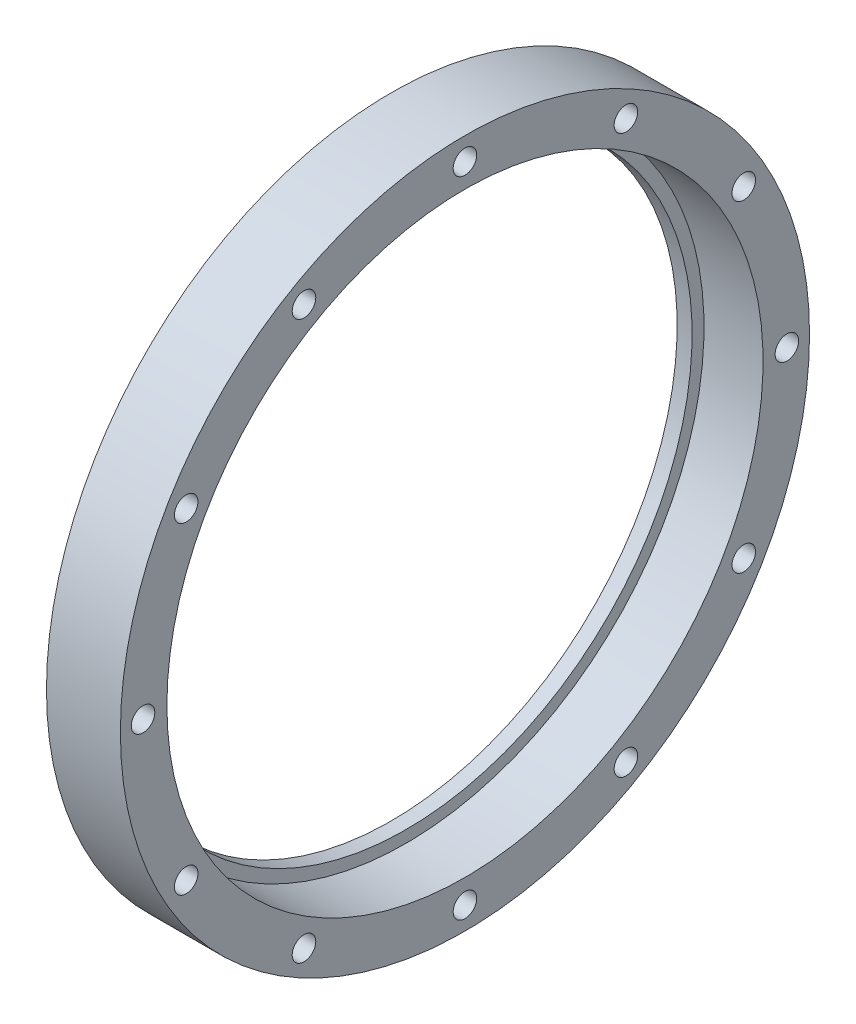
ISO-10303-21;
HEADER;
FILE_DESCRIPTION(('STEP AP214'),'2;1');
FILE_NAME('part.step','',(''),(''),'','','');
FILE_SCHEMA(('AUTOMOTIVE_DESIGN { 1 0 10303 214 1 1 1 1 }'));
ENDSEC;
DATA;
#1=APPLICATION_CONTEXT('core data for automotive mechanical design processes');
#2=APPLICATION_PROTOCOL_DEFINITION('international standard','automotive_design',2000,#1);
#3=PRODUCT_CONTEXT('',#1,'mechanical');
#4=PRODUCT('Part','Part','',(#3));
#5=PRODUCT_RELATED_PRODUCT_CATEGORY('part','',(#4));
#6=PRODUCT_DEFINITION_FORMATION('','',#4);
#7=PRODUCT_DEFINITION_CONTEXT('part definition',#1,'design');
#8=PRODUCT_DEFINITION('design','',#6,#7);
#9=PRODUCT_DEFINITION_SHAPE('','',#8);
#10=(LENGTH_UNIT() NAMED_UNIT(*) SI_UNIT(.MILLI.,.METRE.));
#11=(NAMED_UNIT(*) PLANE_ANGLE_UNIT() SI_UNIT($,.RADIAN.));
#12=(NAMED_UNIT(*) SI_UNIT($,.STERADIAN.) SOLID_ANGLE_UNIT());
#13=UNCERTAINTY_MEASURE_WITH_UNIT(LENGTH_MEASURE(1.E-05),#10,'distance_accuracy_value','');
#14=(GEOMETRIC_REPRESENTATION_CONTEXT(3) GLOBAL_UNCERTAINTY_ASSIGNED_CONTEXT((#13)) GLOBAL_UNIT_ASSIGNED_CONTEXT((#10,
#11,#12)) REPRESENTATION_CONTEXT('',''));
#15=CARTESIAN_POINT('',(0.,0.,0.));
#16=DIRECTION('',(0.,0.,1.));
#17=DIRECTION('',(1.,0.,0.));
#18=AXIS2_PLACEMENT_3D('',#15,#16,#17);
#19=CARTESIAN_POINT('',(0.,0.,0.));
#20=DIRECTION('',(-1.,0.,0.));
#21=DIRECTION('',(0.,0.,1.));
#22=AXIS2_PLACEMENT_3D('',#19,#20,#21);
#23=CYLINDRICAL_SURFACE('',#22,57.8);
#24=CARTESIAN_POINT('',(12.4,0.,0.));
#25=DIRECTION('',(-1.,0.,0.));
#26=DIRECTION('',(0.,0.,1.));
#27=AXIS2_PLACEMENT_3D('',#24,#25,#26);
#28=CIRCLE('',#27,57.8);
#29=CARTESIAN_POINT('',(12.4,0.,57.8));
#30=VERTEX_POINT('',#29);
#31=EDGE_CURVE('E202',#30,#30,#28,.T.);
#32=ORIENTED_EDGE('',*,*,#31,.T.);
#33=EDGE_LOOP('',(#32));
#34=FACE_BOUND('',#33,.T.);
#35=CARTESIAN_POINT('',(0.,0.,0.));
#36=DIRECTION('',(-1.,0.,0.));
#37=DIRECTION('',(0.,0.,1.));
#38=AXIS2_PLACEMENT_3D('',#35,#36,#37);
#39=CIRCLE('',#38,57.8);
#40=CARTESIAN_POINT('',(0.,0.,57.8));
#41=VERTEX_POINT('',#40);
#42=EDGE_CURVE('E10',#41,#41,#39,.T.);
#43=ORIENTED_EDGE('',*,*,#42,.F.);
#44=EDGE_LOOP('',(#43));
#45=FACE_BOUND('',#44,.T.);
#46=ADVANCED_FACE('F47',(#34,#45),#23,.T.);
#47=CARTESIAN_POINT('',(0.,0.,0.));
#48=DIRECTION('',(-1.,0.,0.));
#49=DIRECTION('',(0.,0.,1.));
#50=AXIS2_PLACEMENT_3D('',#47,#48,#49);
#51=PLANE('',#50);
#52=CARTESIAN_POINT('',(0.,46.76537180436,-26.9999999999994));
#53=DIRECTION('',(1.,0.,0.));
#54=DIRECTION('',(0.,0.,-1.));
#55=AXIS2_PLACEMENT_3D('',#52,#53,#54);
#56=CIRCLE('',#55,1.24999999999999);
#57=CARTESIAN_POINT('',(0.,46.76537180436,-28.2499999999994));
#58=VERTEX_POINT('',#57);
#59=EDGE_CURVE('E71',#58,#58,#56,.T.);
#60=ORIENTED_EDGE('',*,*,#59,.T.);
#61=EDGE_LOOP('',(#60));
#62=FACE_BOUND('',#61,.T.);
#63=CARTESIAN_POINT('',(0.,27.0000000000005,-46.7653718043594));
#64=DIRECTION('',(1.,0.,0.));
#65=DIRECTION('',(0.,0.,-1.));
#66=AXIS2_PLACEMENT_3D('',#63,#64,#65);
#67=CIRCLE('',#66,1.25);
#68=CARTESIAN_POINT('',(0.,27.0000000000005,-48.0153718043594));
#69=VERTEX_POINT('',#68);
#70=EDGE_CURVE('E165',#69,#69,#67,.T.);
#71=ORIENTED_EDGE('',*,*,#70,.T.);
#72=EDGE_LOOP('',(#71));
#73=FACE_BOUND('',#72,.T.);
#74=CARTESIAN_POINT('',(0.,5.65619976892588E-13,-54.));
#75=DIRECTION('',(1.,0.,0.));
#76=DIRECTION('',(0.,0.,-1.));
#77=AXIS2_PLACEMENT_3D('',#74,#75,#76);
#78=CIRCLE('',#77,1.25);
#79=CARTESIAN_POINT('',(0.,5.65619976892588E-13,-55.25));
#80=VERTEX_POINT('',#79);
#81=EDGE_CURVE('E168',#80,#80,#78,.T.);
#82=ORIENTED_EDGE('',*,*,#81,.T.);
#83=EDGE_LOOP('',(#82));
#84=FACE_BOUND('',#83,.T.);
#85=CARTESIAN_POINT('',(0.,-26.9999999999996,-46.7653718043599));
#86=DIRECTION('',(1.,0.,0.));
#87=DIRECTION('',(0.,0.,-1.));
#88=AXIS2_PLACEMENT_3D('',#85,#86,#87);
#89=CIRCLE('',#88,1.25);
#90=CARTESIAN_POINT('',(0.,-26.9999999999996,-48.0153718043599));
#91=VERTEX_POINT('',#90);
#92=EDGE_CURVE('E171',#91,#91,#89,.T.);
#93=ORIENTED_EDGE('',*,*,#92,.T.);
#94=EDGE_LOOP('',(#93));
#95=FACE_BOUND('',#94,.T.);
#96=CARTESIAN_POINT('',(0.,-46.7653718043595,-27.0000000000004));
#97=DIRECTION('',(1.,0.,0.));
#98=DIRECTION('',(0.,0.,-1.));
#99=AXIS2_PLACEMENT_3D('',#96,#97,#98);
#100=CIRCLE('',#99,1.24999999999999);
#101=CARTESIAN_POINT('',(0.,-46.7653718043595,-28.2500000000004));
#102=VERTEX_POINT('',#101);
#103=EDGE_CURVE('E174',#102,#102,#100,.T.);
#104=ORIENTED_EDGE('',*,*,#103,.T.);
#105=EDGE_LOOP('',(#104));
#106=FACE_BOUND('',#105,.T.);
#107=CARTESIAN_POINT('',(0.,-54.,0.));
#108=DIRECTION('',(1.,0.,0.));
#109=DIRECTION('',(0.,0.,-1.));
#110=AXIS2_PLACEMENT_3D('',#107,#108,#109);
#111=CIRCLE('',#110,1.24999999999999);
#112=CARTESIAN_POINT('',(0.,-54.,-1.24999999999999));
#113=VERTEX_POINT('',#112);
#114=EDGE_CURVE('E177',#113,#113,#111,.T.);
#115=ORIENTED_EDGE('',*,*,#114,.T.);
#116=EDGE_LOOP('',(#115));
#117=FACE_BOUND('',#116,.T.);
#118=CARTESIAN_POINT('',(0.,-46.7653718043598,26.9999999999997));
#119=DIRECTION('',(1.,0.,0.));
#120=DIRECTION('',(0.,0.,-1.));
#121=AXIS2_PLACEMENT_3D('',#118,#119,#120);
#122=CIRCLE('',#121,1.24999999999999);
#123=CARTESIAN_POINT('',(0.,-46.7653718043598,25.7499999999997));
#124=VERTEX_POINT('',#123);
#125=EDGE_CURVE('E180',#124,#124,#122,.T.);
#126=ORIENTED_EDGE('',*,*,#125,.T.);
#127=EDGE_LOOP('',(#126));
#128=FACE_BOUND('',#127,.T.);
#129=CARTESIAN_POINT('',(0.,-27.0000000000002,46.7653718043596));
#130=DIRECTION('',(1.,0.,0.));
#131=DIRECTION('',(0.,0.,-1.));
#132=AXIS2_PLACEMENT_3D('',#129,#130,#131);
#133=CIRCLE('',#132,1.25);
#134=CARTESIAN_POINT('',(0.,-27.0000000000002,45.5153718043596));
#135=VERTEX_POINT('',#134);
#136=EDGE_CURVE('E183',#135,#135,#133,.T.);
#137=ORIENTED_EDGE('',*,*,#136,.T.);
#138=EDGE_LOOP('',(#137));
#139=FACE_BOUND('',#138,.T.);
#140=CARTESIAN_POINT('',(0.,-1.88539992297529E-13,54.));
#141=DIRECTION('',(1.,0.,0.));
#142=DIRECTION('',(0.,0.,-1.));
#143=AXIS2_PLACEMENT_3D('',#140,#141,#142);
#144=CIRCLE('',#143,1.25);
#145=CARTESIAN_POINT('',(0.,-1.88539992297529E-13,52.75));
#146=VERTEX_POINT('',#145);
#147=EDGE_CURVE('E186',#146,#146,#144,.T.);
#148=ORIENTED_EDGE('',*,*,#147,.T.);
#149=EDGE_LOOP('',(#148));
#150=FACE_BOUND('',#149,.T.);
#151=CARTESIAN_POINT('',(0.,26.9999999999999,46.7653718043598));
#152=DIRECTION('',(1.,0.,0.));
#153=DIRECTION('',(0.,0.,-1.));
#154=AXIS2_PLACEMENT_3D('',#151,#152,#153);
#155=CIRCLE('',#154,1.25);
#156=CARTESIAN_POINT('',(0.,26.9999999999999,45.5153718043598));
#157=VERTEX_POINT('',#156);
#158=EDGE_CURVE('E189',#157,#157,#155,.T.);
#159=ORIENTED_EDGE('',*,*,#158,.T.);
#160=EDGE_LOOP('',(#159));
#161=FACE_BOUND('',#160,.T.);
#162=CARTESIAN_POINT('',(0.,46.7653718043597,27.0000000000001));
#163=DIRECTION('',(1.,0.,0.));
#164=DIRECTION('',(0.,0.,-1.));
#165=AXIS2_PLACEMENT_3D('',#162,#163,#164);
#166=CIRCLE('',#165,1.24999999999999);
#167=CARTESIAN_POINT('',(0.,46.7653718043597,25.7500000000001));
#168=VERTEX_POINT('',#167);
#169=EDGE_CURVE('E192',#168,#168,#166,.T.);
#170=ORIENTED_EDGE('',*,*,#169,.T.);
#171=EDGE_LOOP('',(#170));
#172=FACE_BOUND('',#171,.T.);
#173=CARTESIAN_POINT('',(0.,54.,0.));
#174=DIRECTION('',(1.,0.,0.));
#175=DIRECTION('',(0.,0.,-1.));
#176=AXIS2_PLACEMENT_3D('',#173,#174,#175);
#177=CIRCLE('',#176,1.24999999999999);
#178=CARTESIAN_POINT('',(0.,54.,-1.24999999999999));
#179=VERTEX_POINT('',#178);
#180=EDGE_CURVE('E66',#179,#179,#177,.T.);
#181=ORIENTED_EDGE('',*,*,#180,.T.);
#182=EDGE_LOOP('',(#181));
#183=FACE_BOUND('',#182,.T.);
#184=ORIENTED_EDGE('',*,*,#42,.T.);
#185=EDGE_LOOP('',(#184));
#186=FACE_BOUND('',#185,.T.);
#187=CARTESIAN_POINT('',(0.,0.,0.));
#188=DIRECTION('',(-1.,0.,0.));
#189=DIRECTION('',(0.,0.,1.));
#190=AXIS2_PLACEMENT_3D('',#187,#188,#189);
#191=CIRCLE('',#190,48.);
#192=CARTESIAN_POINT('',(0.,0.,48.));
#193=VERTEX_POINT('',#192);
#194=EDGE_CURVE('E54',#193,#193,#191,.T.);
#195=ORIENTED_EDGE('',*,*,#194,.F.);
#196=EDGE_LOOP('',(#195));
#197=FACE_BOUND('',#196,.T.);
#198=ADVANCED_FACE('F218',(#62,#73,#84,#95,#106,#117,#128,#139,#150,#161,#172,#183,#186,#197),
#51,.T.);
#199=CARTESIAN_POINT('',(0.,0.,0.));
#200=DIRECTION('',(-1.,0.,0.));
#201=DIRECTION('',(0.,0.,1.));
#202=AXIS2_PLACEMENT_3D('',#199,#200,#201);
#203=CYLINDRICAL_SURFACE('',#202,48.);
#204=CARTESIAN_POINT('',(2.5,0.,0.));
#205=DIRECTION('',(-1.,0.,0.));
#206=DIRECTION('',(0.,0.,1.));
#207=AXIS2_PLACEMENT_3D('',#204,#205,#206);
#208=CIRCLE('',#207,48.);
#209=CARTESIAN_POINT('',(2.5,0.,48.));
#210=VERTEX_POINT('',#209);
#211=EDGE_CURVE('E59',#210,#210,#208,.T.);
#212=ORIENTED_EDGE('',*,*,#211,.F.);
#213=EDGE_LOOP('',(#212));
#214=FACE_BOUND('',#213,.T.);
#215=ORIENTED_EDGE('',*,*,#194,.T.);
#216=EDGE_LOOP('',(#215));
#217=FACE_BOUND('',#216,.T.);
#218=ADVANCED_FACE('F215',(#214,#217),#203,.F.);
#219=CARTESIAN_POINT('',(2.5,0.,0.));
#220=DIRECTION('',(-1.,0.,0.));
#221=DIRECTION('',(0.,0.,1.));
#222=AXIS2_PLACEMENT_3D('',#219,#220,#221);
#223=PLANE('',#222);
#224=CARTESIAN_POINT('',(2.5,0.,0.));
#225=DIRECTION('',(-1.,0.,0.));
#226=DIRECTION('',(0.,0.,1.));
#227=AXIS2_PLACEMENT_3D('',#224,#225,#226);
#228=CIRCLE('',#227,50.);
#229=CARTESIAN_POINT('',(2.5,0.,50.));
#230=VERTEX_POINT('',#229);
#231=EDGE_CURVE('E208',#230,#230,#228,.T.);
#232=ORIENTED_EDGE('',*,*,#231,.F.);
#233=EDGE_LOOP('',(#232));
#234=FACE_BOUND('',#233,.T.);
#235=ORIENTED_EDGE('',*,*,#211,.T.);
#236=EDGE_LOOP('',(#235));
#237=FACE_BOUND('',#236,.T.);
#238=ADVANCED_FACE('F213',(#234,#237),#223,.F.);
#239=CARTESIAN_POINT('',(0.,0.,0.));
#240=DIRECTION('',(-1.,0.,0.));
#241=DIRECTION('',(0.,0.,1.));
#242=AXIS2_PLACEMENT_3D('',#239,#240,#241);
#243=CYLINDRICAL_SURFACE('',#242,50.);
#244=CARTESIAN_POINT('',(12.4,0.,0.));
#245=DIRECTION('',(-1.,0.,0.));
#246=DIRECTION('',(0.,0.,1.));
#247=AXIS2_PLACEMENT_3D('',#244,#245,#246);
#248=CIRCLE('',#247,50.);
#249=CARTESIAN_POINT('',(12.4,0.,50.));
#250=VERTEX_POINT('',#249);
#251=EDGE_CURVE('E205',#250,#250,#248,.T.);
#252=ORIENTED_EDGE('',*,*,#251,.F.);
#253=EDGE_LOOP('',(#252));
#254=FACE_BOUND('',#253,.T.);
#255=ORIENTED_EDGE('',*,*,#231,.T.);
#256=EDGE_LOOP('',(#255));
#257=FACE_BOUND('',#256,.T.);
#258=ADVANCED_FACE('F234',(#254,#257),#243,.F.);
#259=CARTESIAN_POINT('',(12.4,0.,0.));
#260=DIRECTION('',(1.,0.,0.));
#261=DIRECTION('',(0.,0.,-1.));
#262=AXIS2_PLACEMENT_3D('',#259,#260,#261);
#263=PLANE('',#262);
#264=CARTESIAN_POINT('',(12.4,46.76537180436,-26.9999999999994));
#265=DIRECTION('',(1.,0.,0.));
#266=DIRECTION('',(0.,0.,-1.));
#267=AXIS2_PLACEMENT_3D('',#264,#265,#266);
#268=CIRCLE('',#267,1.975);
#269=CARTESIAN_POINT('',(12.4,46.76537180436,-28.9749999999994));
#270=VERTEX_POINT('',#269);
#271=EDGE_CURVE('E390',#270,#270,#268,.T.);
#272=ORIENTED_EDGE('',*,*,#271,.F.);
#273=EDGE_LOOP('',(#272));
#274=FACE_BOUND('',#273,.T.);
#275=CARTESIAN_POINT('',(12.4,27.0000000000005,-46.7653718043594));
#276=DIRECTION('',(1.,0.,0.));
#277=DIRECTION('',(0.,0.,-1.));
#278=AXIS2_PLACEMENT_3D('',#275,#276,#277);
#279=CIRCLE('',#278,1.975);
#280=CARTESIAN_POINT('',(12.4,27.0000000000005,-48.7403718043594));
#281=VERTEX_POINT('',#280);
#282=EDGE_CURVE('E121',#281,#281,#279,.T.);
#283=ORIENTED_EDGE('',*,*,#282,.F.);
#284=EDGE_LOOP('',(#283));
#285=FACE_BOUND('',#284,.T.);
#286=CARTESIAN_POINT('',(12.4,5.65619976892588E-13,-54.));
#287=DIRECTION('',(1.,0.,0.));
#288=DIRECTION('',(0.,0.,-1.));
#289=AXIS2_PLACEMENT_3D('',#286,#287,#288);
#290=CIRCLE('',#289,1.975);
#291=CARTESIAN_POINT('',(12.4,5.65619976892588E-13,-55.975));
#292=VERTEX_POINT('',#291);
#293=EDGE_CURVE('E114',#292,#292,#290,.T.);
#294=ORIENTED_EDGE('',*,*,#293,.F.);
#295=EDGE_LOOP('',(#294));
#296=FACE_BOUND('',#295,.T.);
#297=CARTESIAN_POINT('',(12.4,-26.9999999999996,-46.7653718043599));
#298=DIRECTION('',(1.,0.,0.));
#299=DIRECTION('',(0.,0.,-1.));
#300=AXIS2_PLACEMENT_3D('',#297,#298,#299);
#301=CIRCLE('',#300,1.975);
#302=CARTESIAN_POINT('',(12.4,-26.9999999999996,-48.7403718043599));
#303=VERTEX_POINT('',#302);
#304=EDGE_CURVE('E110',#303,#303,#301,.T.);
#305=ORIENTED_EDGE('',*,*,#304,.F.);
#306=EDGE_LOOP('',(#305));
#307=FACE_BOUND('',#306,.T.);
#308=CARTESIAN_POINT('',(12.4,-46.7653718043595,-27.0000000000004));
#309=DIRECTION('',(1.,0.,0.));
#310=DIRECTION('',(0.,0.,-1.));
#311=AXIS2_PLACEMENT_3D('',#308,#309,#310);
#312=CIRCLE('',#311,1.975);
#313=CARTESIAN_POINT('',(12.4,-46.7653718043595,-28.9750000000004));
#314=VERTEX_POINT('',#313);
#315=EDGE_CURVE('E106',#314,#314,#312,.T.);
#316=ORIENTED_EDGE('',*,*,#315,.F.);
#317=EDGE_LOOP('',(#316));
#318=FACE_BOUND('',#317,.T.);
#319=CARTESIAN_POINT('',(12.4,-54.,0.));
#320=DIRECTION('',(1.,0.,0.));
#321=DIRECTION('',(0.,0.,-1.));
#322=AXIS2_PLACEMENT_3D('',#319,#320,#321);
#323=CIRCLE('',#322,1.975);
#324=CARTESIAN_POINT('',(12.4,-54.,-1.975));
#325=VERTEX_POINT('',#324);
#326=EDGE_CURVE('E101',#325,#325,#323,.T.);
#327=ORIENTED_EDGE('',*,*,#326,.F.);
#328=EDGE_LOOP('',(#327));
#329=FACE_BOUND('',#328,.T.);
#330=CARTESIAN_POINT('',(12.4,-46.7653718043598,26.9999999999997));
#331=DIRECTION('',(1.,0.,0.));
#332=DIRECTION('',(0.,0.,-1.));
#333=AXIS2_PLACEMENT_3D('',#330,#331,#332);
#334=CIRCLE('',#333,1.975);
#335=CARTESIAN_POINT('',(12.4,-46.7653718043598,25.0249999999997));
#336=VERTEX_POINT('',#335);
#337=EDGE_CURVE('E96',#336,#336,#334,.T.);
#338=ORIENTED_EDGE('',*,*,#337,.F.);
#339=EDGE_LOOP('',(#338));
#340=FACE_BOUND('',#339,.T.);
#341=CARTESIAN_POINT('',(12.4,-27.0000000000002,46.7653718043596));
#342=DIRECTION('',(1.,0.,0.));
#343=DIRECTION('',(0.,0.,-1.));
#344=AXIS2_PLACEMENT_3D('',#341,#342,#343);
#345=CIRCLE('',#344,1.975);
#346=CARTESIAN_POINT('',(12.4,-27.0000000000002,44.7903718043596));
#347=VERTEX_POINT('',#346);
#348=EDGE_CURVE('E91',#347,#347,#345,.T.);
#349=ORIENTED_EDGE('',*,*,#348,.F.);
#350=EDGE_LOOP('',(#349));
#351=FACE_BOUND('',#350,.T.);
#352=CARTESIAN_POINT('',(12.4,-1.88539992297529E-13,54.));
#353=DIRECTION('',(1.,0.,0.));
#354=DIRECTION('',(0.,0.,-1.));
#355=AXIS2_PLACEMENT_3D('',#352,#353,#354);
#356=CIRCLE('',#355,1.975);
#357=CARTESIAN_POINT('',(12.4,-1.88539992297529E-13,52.025));
#358=VERTEX_POINT('',#357);
#359=EDGE_CURVE('E86',#358,#358,#356,.T.);
#360=ORIENTED_EDGE('',*,*,#359,.F.);
#361=EDGE_LOOP('',(#360));
#362=FACE_BOUND('',#361,.T.);
#363=CARTESIAN_POINT('',(12.4,26.9999999999999,46.7653718043598));
#364=DIRECTION('',(1.,0.,0.));
#365=DIRECTION('',(0.,0.,-1.));
#366=AXIS2_PLACEMENT_3D('',#363,#364,#365);
#367=CIRCLE('',#366,1.975);
#368=CARTESIAN_POINT('',(12.4,26.9999999999999,44.7903718043598));
#369=VERTEX_POINT('',#368);
#370=EDGE_CURVE('E81',#369,#369,#367,.T.);
#371=ORIENTED_EDGE('',*,*,#370,.F.);
#372=EDGE_LOOP('',(#371));
#373=FACE_BOUND('',#372,.T.);
#374=CARTESIAN_POINT('',(12.4,46.7653718043597,27.0000000000001));
#375=DIRECTION('',(1.,0.,0.));
#376=DIRECTION('',(0.,0.,-1.));
#377=AXIS2_PLACEMENT_3D('',#374,#375,#376);
#378=CIRCLE('',#377,1.975);
#379=CARTESIAN_POINT('',(12.4,46.7653718043597,25.0250000000001));
#380=VERTEX_POINT('',#379);
#381=EDGE_CURVE('E76',#380,#380,#378,.T.);
#382=ORIENTED_EDGE('',*,*,#381,.F.);
#383=EDGE_LOOP('',(#382));
#384=FACE_BOUND('',#383,.T.);
#385=CARTESIAN_POINT('',(12.4,54.,0.));
#386=DIRECTION('',(1.,0.,0.));
#387=DIRECTION('',(0.,0.,-1.));
#388=AXIS2_PLACEMENT_3D('',#385,#386,#387);
#389=CIRCLE('',#388,1.975);
#390=CARTESIAN_POINT('',(12.4,54.,-1.975));
#391=VERTEX_POINT('',#390);
#392=EDGE_CURVE('E195',#391,#391,#389,.T.);
#393=ORIENTED_EDGE('',*,*,#392,.F.);
#394=EDGE_LOOP('',(#393));
#395=FACE_BOUND('',#394,.T.);
#396=ORIENTED_EDGE('',*,*,#251,.T.);
#397=EDGE_LOOP('',(#396));
#398=FACE_BOUND('',#397,.T.);
#399=ORIENTED_EDGE('',*,*,#31,.F.);
#400=EDGE_LOOP('',(#399));
#401=FACE_BOUND('',#400,.T.);
#402=ADVANCED_FACE('F238',(#274,#285,#296,#307,#318,#329,#340,#351,#362,#373,#384,#395,#398,
#401),#263,.T.);
#403=CARTESIAN_POINT('',(12.4,54.,0.));
#404=DIRECTION('',(1.,0.,0.));
#405=DIRECTION('',(0.,0.,-1.));
#406=AXIS2_PLACEMENT_3D('',#403,#404,#405);
#407=CYLINDRICAL_SURFACE('',#406,1.25);
#408=CARTESIAN_POINT('',(7.96437605120502,54.,0.));
#409=DIRECTION('',(1.,0.,0.));
#410=DIRECTION('',(0.,0.,-1.));
#411=AXIS2_PLACEMENT_3D('',#408,#409,#410);
#412=CIRCLE('',#411,1.25);
#413=CARTESIAN_POINT('',(7.96437605120502,54.,-1.25));
#414=VERTEX_POINT('',#413);
#415=EDGE_CURVE('E63',#414,#414,#412,.T.);
#416=ORIENTED_EDGE('',*,*,#415,.T.);
#417=EDGE_LOOP('',(#416));
#418=FACE_BOUND('',#417,.T.);
#419=ORIENTED_EDGE('',*,*,#180,.F.);
#420=EDGE_LOOP('',(#419));
#421=FACE_BOUND('',#420,.T.);
#422=ADVANCED_FACE('F241',(#418,#421),#407,.F.);
#423=CARTESIAN_POINT('',(8.4,54.,0.));
#424=DIRECTION('',(1.,0.,0.));
#425=DIRECTION('',(0.,0.,-1.));
#426=AXIS2_PLACEMENT_3D('',#423,#424,#425);
#427=CONICAL_SURFACE('',#426,1.975,1.02974425867665);
#428=CARTESIAN_POINT('',(8.4,54.,0.));
#429=DIRECTION('',(1.,0.,0.));
#430=DIRECTION('',(0.,0.,-1.));
#431=AXIS2_PLACEMENT_3D('',#428,#429,#430);
#432=CIRCLE('',#431,1.975);
#433=CARTESIAN_POINT('',(8.4,54.,-1.975));
#434=VERTEX_POINT('',#433);
#435=EDGE_CURVE('E67',#434,#434,#432,.T.);
#436=ORIENTED_EDGE('',*,*,#435,.T.);
#437=EDGE_LOOP('',(#436));
#438=FACE_BOUND('',#437,.T.);
#439=ORIENTED_EDGE('',*,*,#415,.F.);
#440=EDGE_LOOP('',(#439));
#441=FACE_BOUND('',#440,.T.);
#442=ADVANCED_FACE('F245',(#438,#441),#427,.F.);
#443=CARTESIAN_POINT('',(12.4,54.,0.));
#444=DIRECTION('',(1.,0.,0.));
#445=DIRECTION('',(0.,0.,-1.));
#446=AXIS2_PLACEMENT_3D('',#443,#444,#445);
#447=CYLINDRICAL_SURFACE('',#446,1.975);
#448=ORIENTED_EDGE('',*,*,#435,.F.);
#449=EDGE_LOOP('',(#448));
#450=FACE_BOUND('',#449,.T.);
#451=ORIENTED_EDGE('',*,*,#392,.T.);
#452=EDGE_LOOP('',(#451));
#453=FACE_BOUND('',#452,.T.);
#454=ADVANCED_FACE('F249',(#450,#453),#447,.F.);
#455=CARTESIAN_POINT('',(12.4,46.7653718043597,27.0000000000001));
#456=DIRECTION('',(1.,0.,0.));
#457=DIRECTION('',(0.,0.,-1.));
#458=AXIS2_PLACEMENT_3D('',#455,#456,#457);
#459=CYLINDRICAL_SURFACE('',#458,1.25);
#460=CARTESIAN_POINT('',(7.96437605120502,46.7653718043597,27.0000000000001));
#461=DIRECTION('',(1.,0.,0.));
#462=DIRECTION('',(0.,0.,-1.));
#463=AXIS2_PLACEMENT_3D('',#460,#461,#462);
#464=CIRCLE('',#463,1.25);
#465=CARTESIAN_POINT('',(7.96437605120502,46.7653718043597,25.7500000000001));
#466=VERTEX_POINT('',#465);
#467=EDGE_CURVE('E68',#466,#466,#464,.T.);
#468=ORIENTED_EDGE('',*,*,#467,.T.);
#469=EDGE_LOOP('',(#468));
#470=FACE_BOUND('',#469,.T.);
#471=ORIENTED_EDGE('',*,*,#169,.F.);
#472=EDGE_LOOP('',(#471));
#473=FACE_BOUND('',#472,.T.);
#474=ADVANCED_FACE('F252',(#470,#473),#459,.F.);
#475=CARTESIAN_POINT('',(12.4,26.9999999999999,46.7653718043598));
#476=DIRECTION('',(1.,0.,0.));
#477=DIRECTION('',(0.,0.,-1.));
#478=AXIS2_PLACEMENT_3D('',#475,#476,#477);
#479=CYLINDRICAL_SURFACE('',#478,1.25);
#480=CARTESIAN_POINT('',(7.96437605120502,26.9999999999999,46.7653718043598));
#481=DIRECTION('',(1.,0.,0.));
#482=DIRECTION('',(0.,0.,-1.));
#483=AXIS2_PLACEMENT_3D('',#480,#481,#482);
#484=CIRCLE('',#483,1.25);
#485=CARTESIAN_POINT('',(7.96437605120502,26.9999999999999,45.5153718043598));
#486=VERTEX_POINT('',#485);
#487=EDGE_CURVE('E73',#486,#486,#484,.T.);
#488=ORIENTED_EDGE('',*,*,#487,.T.);
#489=EDGE_LOOP('',(#488));
#490=FACE_BOUND('',#489,.T.);
#491=ORIENTED_EDGE('',*,*,#158,.F.);
#492=EDGE_LOOP('',(#491));
#493=FACE_BOUND('',#492,.T.);
#494=ADVANCED_FACE('F256',(#490,#493),#479,.F.);
#495=CARTESIAN_POINT('',(12.4,-1.88539992297529E-13,54.));
#496=DIRECTION('',(1.,0.,0.));
#497=DIRECTION('',(0.,0.,-1.));
#498=AXIS2_PLACEMENT_3D('',#495,#496,#497);
#499=CYLINDRICAL_SURFACE('',#498,1.25);
#500=CARTESIAN_POINT('',(7.96437605120502,-1.88539992297529E-13,54.));
#501=DIRECTION('',(1.,0.,0.));
#502=DIRECTION('',(0.,0.,-1.));
#503=AXIS2_PLACEMENT_3D('',#500,#501,#502);
#504=CIRCLE('',#503,1.25);
#505=CARTESIAN_POINT('',(7.96437605120502,-1.88539992297529E-13,52.75));
#506=VERTEX_POINT('',#505);
#507=EDGE_CURVE('E78',#506,#506,#504,.T.);
#508=ORIENTED_EDGE('',*,*,#507,.T.);
#509=EDGE_LOOP('',(#508));
#510=FACE_BOUND('',#509,.T.);
#511=ORIENTED_EDGE('',*,*,#147,.F.);
#512=EDGE_LOOP('',(#511));
#513=FACE_BOUND('',#512,.T.);
#514=ADVANCED_FACE('F260',(#510,#513),#499,.F.);
#515=CARTESIAN_POINT('',(12.4,-27.0000000000002,46.7653718043596));
#516=DIRECTION('',(1.,0.,0.));
#517=DIRECTION('',(0.,0.,-1.));
#518=AXIS2_PLACEMENT_3D('',#515,#516,#517);
#519=CYLINDRICAL_SURFACE('',#518,1.25);
#520=CARTESIAN_POINT('',(7.96437605120502,-27.0000000000002,46.7653718043596));
#521=DIRECTION('',(1.,0.,0.));
#522=DIRECTION('',(0.,0.,-1.));
#523=AXIS2_PLACEMENT_3D('',#520,#521,#522);
#524=CIRCLE('',#523,1.25);
#525=CARTESIAN_POINT('',(7.96437605120502,-27.0000000000002,45.5153718043596));
#526=VERTEX_POINT('',#525);
#527=EDGE_CURVE('E83',#526,#526,#524,.T.);
#528=ORIENTED_EDGE('',*,*,#527,.T.);
#529=EDGE_LOOP('',(#528));
#530=FACE_BOUND('',#529,.T.);
#531=ORIENTED_EDGE('',*,*,#136,.F.);
#532=EDGE_LOOP('',(#531));
#533=FACE_BOUND('',#532,.T.);
#534=ADVANCED_FACE('F264',(#530,#533),#519,.F.);
#535=CARTESIAN_POINT('',(12.4,-46.7653718043598,26.9999999999997));
#536=DIRECTION('',(1.,0.,0.));
#537=DIRECTION('',(0.,0.,-1.));
#538=AXIS2_PLACEMENT_3D('',#535,#536,#537);
#539=CYLINDRICAL_SURFACE('',#538,1.25);
#540=CARTESIAN_POINT('',(7.96437605120502,-46.7653718043598,26.9999999999997));
#541=DIRECTION('',(1.,0.,0.));
#542=DIRECTION('',(0.,0.,-1.));
#543=AXIS2_PLACEMENT_3D('',#540,#541,#542);
#544=CIRCLE('',#543,1.25);
#545=CARTESIAN_POINT('',(7.96437605120502,-46.7653718043598,25.7499999999997));
#546=VERTEX_POINT('',#545);
#547=EDGE_CURVE('E88',#546,#546,#544,.T.);
#548=ORIENTED_EDGE('',*,*,#547,.T.);
#549=EDGE_LOOP('',(#548));
#550=FACE_BOUND('',#549,.T.);
#551=ORIENTED_EDGE('',*,*,#125,.F.);
#552=EDGE_LOOP('',(#551));
#553=FACE_BOUND('',#552,.T.);
#554=ADVANCED_FACE('F268',(#550,#553),#539,.F.);
#555=CARTESIAN_POINT('',(12.4,-54.,0.));
#556=DIRECTION('',(1.,0.,0.));
#557=DIRECTION('',(0.,0.,-1.));
#558=AXIS2_PLACEMENT_3D('',#555,#556,#557);
#559=CYLINDRICAL_SURFACE('',#558,1.25);
#560=CARTESIAN_POINT('',(7.96437605120502,-54.,0.));
#561=DIRECTION('',(1.,0.,0.));
#562=DIRECTION('',(0.,0.,-1.));
#563=AXIS2_PLACEMENT_3D('',#560,#561,#562);
#564=CIRCLE('',#563,1.25);
#565=CARTESIAN_POINT('',(7.96437605120502,-54.,-1.25));
#566=VERTEX_POINT('',#565);
#567=EDGE_CURVE('E93',#566,#566,#564,.T.);
#568=ORIENTED_EDGE('',*,*,#567,.T.);
#569=EDGE_LOOP('',(#568));
#570=FACE_BOUND('',#569,.T.);
#571=ORIENTED_EDGE('',*,*,#114,.F.);
#572=EDGE_LOOP('',(#571));
#573=FACE_BOUND('',#572,.T.);
#574=ADVANCED_FACE('F272',(#570,#573),#559,.F.);
#575=CARTESIAN_POINT('',(12.4,-46.7653718043595,-27.0000000000004));
#576=DIRECTION('',(1.,0.,0.));
#577=DIRECTION('',(0.,0.,-1.));
#578=AXIS2_PLACEMENT_3D('',#575,#576,#577);
#579=CYLINDRICAL_SURFACE('',#578,1.25);
#580=CARTESIAN_POINT('',(7.96437605120502,-46.7653718043595,-27.0000000000004));
#581=DIRECTION('',(1.,0.,0.));
#582=DIRECTION('',(0.,0.,-1.));
#583=AXIS2_PLACEMENT_3D('',#580,#581,#582);
#584=CIRCLE('',#583,1.25);
#585=CARTESIAN_POINT('',(7.96437605120502,-46.7653718043595,-28.2500000000004));
#586=VERTEX_POINT('',#585);
#587=EDGE_CURVE('E98',#586,#586,#584,.T.);
#588=ORIENTED_EDGE('',*,*,#587,.T.);
#589=EDGE_LOOP('',(#588));
#590=FACE_BOUND('',#589,.T.);
#591=ORIENTED_EDGE('',*,*,#103,.F.);
#592=EDGE_LOOP('',(#591));
#593=FACE_BOUND('',#592,.T.);
#594=ADVANCED_FACE('F276',(#590,#593),#579,.F.);
#595=CARTESIAN_POINT('',(12.4,-26.9999999999996,-46.7653718043599));
#596=DIRECTION('',(1.,0.,0.));
#597=DIRECTION('',(0.,0.,-1.));
#598=AXIS2_PLACEMENT_3D('',#595,#596,#597);
#599=CYLINDRICAL_SURFACE('',#598,1.25);
#600=CARTESIAN_POINT('',(7.96437605120502,-26.9999999999996,-46.7653718043599));
#601=DIRECTION('',(1.,0.,0.));
#602=DIRECTION('',(0.,0.,-1.));
#603=AXIS2_PLACEMENT_3D('',#600,#601,#602);
#604=CIRCLE('',#603,1.25);
#605=CARTESIAN_POINT('',(7.96437605120502,-26.9999999999996,-48.0153718043599));
#606=VERTEX_POINT('',#605);
#607=EDGE_CURVE('E103',#606,#606,#604,.T.);
#608=ORIENTED_EDGE('',*,*,#607,.T.);
#609=EDGE_LOOP('',(#608));
#610=FACE_BOUND('',#609,.T.);
#611=ORIENTED_EDGE('',*,*,#92,.F.);
#612=EDGE_LOOP('',(#611));
#613=FACE_BOUND('',#612,.T.);
#614=ADVANCED_FACE('F280',(#610,#613),#599,.F.);
#615=CARTESIAN_POINT('',(12.4,5.65619976892588E-13,-54.));
#616=DIRECTION('',(1.,0.,0.));
#617=DIRECTION('',(0.,0.,-1.));
#618=AXIS2_PLACEMENT_3D('',#615,#616,#617);
#619=CYLINDRICAL_SURFACE('',#618,1.25);
#620=CARTESIAN_POINT('',(7.96437605120502,5.65619976892588E-13,-54.));
#621=DIRECTION('',(1.,0.,0.));
#622=DIRECTION('',(0.,0.,-1.));
#623=AXIS2_PLACEMENT_3D('',#620,#621,#622);
#624=CIRCLE('',#623,1.25);
#625=CARTESIAN_POINT('',(7.96437605120502,5.65619976892588E-13,-55.25));
#626=VERTEX_POINT('',#625);
#627=EDGE_CURVE('E108',#626,#626,#624,.T.);
#628=ORIENTED_EDGE('',*,*,#627,.T.);
#629=EDGE_LOOP('',(#628));
#630=FACE_BOUND('',#629,.T.);
#631=ORIENTED_EDGE('',*,*,#81,.F.);
#632=EDGE_LOOP('',(#631));
#633=FACE_BOUND('',#632,.T.);
#634=ADVANCED_FACE('F284',(#630,#633),#619,.F.);
#635=CARTESIAN_POINT('',(12.4,27.0000000000005,-46.7653718043594));
#636=DIRECTION('',(1.,0.,0.));
#637=DIRECTION('',(0.,0.,-1.));
#638=AXIS2_PLACEMENT_3D('',#635,#636,#637);
#639=CYLINDRICAL_SURFACE('',#638,1.25);
#640=CARTESIAN_POINT('',(7.96437605120502,27.0000000000005,-46.7653718043594));
#641=DIRECTION('',(1.,0.,0.));
#642=DIRECTION('',(0.,0.,-1.));
#643=AXIS2_PLACEMENT_3D('',#640,#641,#642);
#644=CIRCLE('',#643,1.25);
#645=CARTESIAN_POINT('',(7.96437605120502,27.0000000000005,-48.0153718043594));
#646=VERTEX_POINT('',#645);
#647=EDGE_CURVE('E112',#646,#646,#644,.T.);
#648=ORIENTED_EDGE('',*,*,#647,.T.);
#649=EDGE_LOOP('',(#648));
#650=FACE_BOUND('',#649,.T.);
#651=ORIENTED_EDGE('',*,*,#70,.F.);
#652=EDGE_LOOP('',(#651));
#653=FACE_BOUND('',#652,.T.);
#654=ADVANCED_FACE('F288',(#650,#653),#639,.F.);
#655=CARTESIAN_POINT('',(12.4,46.76537180436,-26.9999999999994));
#656=DIRECTION('',(1.,0.,0.));
#657=DIRECTION('',(0.,0.,-1.));
#658=AXIS2_PLACEMENT_3D('',#655,#656,#657);
#659=CYLINDRICAL_SURFACE('',#658,1.25);
#660=CARTESIAN_POINT('',(7.96437605120502,46.76537180436,-26.9999999999994));
#661=DIRECTION('',(1.,0.,0.));
#662=DIRECTION('',(0.,0.,-1.));
#663=AXIS2_PLACEMENT_3D('',#660,#661,#662);
#664=CIRCLE('',#663,1.25);
#665=CARTESIAN_POINT('',(7.96437605120502,46.76537180436,-28.2499999999994));
#666=VERTEX_POINT('',#665);
#667=EDGE_CURVE('E50',#666,#666,#664,.T.);
#668=ORIENTED_EDGE('',*,*,#667,.T.);
#669=EDGE_LOOP('',(#668));
#670=FACE_BOUND('',#669,.T.);
#671=ORIENTED_EDGE('',*,*,#59,.F.);
#672=EDGE_LOOP('',(#671));
#673=FACE_BOUND('',#672,.T.);
#674=ADVANCED_FACE('F292',(#670,#673),#659,.F.);
#675=CARTESIAN_POINT('',(8.4,46.7653718043597,27.0000000000001));
#676=DIRECTION('',(1.,0.,0.));
#677=DIRECTION('',(0.,0.,-1.));
#678=AXIS2_PLACEMENT_3D('',#675,#676,#677);
#679=CONICAL_SURFACE('',#678,1.975,1.02974425867665);
#680=CARTESIAN_POINT('',(8.4,46.7653718043597,27.0000000000001));
#681=DIRECTION('',(1.,0.,0.));
#682=DIRECTION('',(0.,0.,-1.));
#683=AXIS2_PLACEMENT_3D('',#680,#681,#682);
#684=CIRCLE('',#683,1.975);
#685=CARTESIAN_POINT('',(8.4,46.7653718043597,25.0250000000001));
#686=VERTEX_POINT('',#685);
#687=EDGE_CURVE('E72',#686,#686,#684,.T.);
#688=ORIENTED_EDGE('',*,*,#687,.T.);
#689=EDGE_LOOP('',(#688));
#690=FACE_BOUND('',#689,.T.);
#691=ORIENTED_EDGE('',*,*,#467,.F.);
#692=EDGE_LOOP('',(#691));
#693=FACE_BOUND('',#692,.T.);
#694=ADVANCED_FACE('F295',(#690,#693),#679,.F.);
#695=CARTESIAN_POINT('',(12.4,46.7653718043597,27.0000000000001));
#696=DIRECTION('',(1.,0.,0.));
#697=DIRECTION('',(0.,0.,-1.));
#698=AXIS2_PLACEMENT_3D('',#695,#696,#697);
#699=CYLINDRICAL_SURFACE('',#698,1.975);
#700=ORIENTED_EDGE('',*,*,#687,.F.);
#701=EDGE_LOOP('',(#700));
#702=FACE_BOUND('',#701,.T.);
#703=ORIENTED_EDGE('',*,*,#381,.T.);
#704=EDGE_LOOP('',(#703));
#705=FACE_BOUND('',#704,.T.);
#706=ADVANCED_FACE('F299',(#702,#705),#699,.F.);
#707=CARTESIAN_POINT('',(8.4,26.9999999999999,46.7653718043598));
#708=DIRECTION('',(1.,0.,0.));
#709=DIRECTION('',(0.,0.,-1.));
#710=AXIS2_PLACEMENT_3D('',#707,#708,#709);
#711=CONICAL_SURFACE('',#710,1.975,1.02974425867665);
#712=CARTESIAN_POINT('',(8.4,26.9999999999999,46.7653718043598));
#713=DIRECTION('',(1.,0.,0.));
#714=DIRECTION('',(0.,0.,-1.));
#715=AXIS2_PLACEMENT_3D('',#712,#713,#714);
#716=CIRCLE('',#715,1.975);
#717=CARTESIAN_POINT('',(8.4,26.9999999999999,44.7903718043598));
#718=VERTEX_POINT('',#717);
#719=EDGE_CURVE('E77',#718,#718,#716,.T.);
#720=ORIENTED_EDGE('',*,*,#719,.T.);
#721=EDGE_LOOP('',(#720));
#722=FACE_BOUND('',#721,.T.);
#723=ORIENTED_EDGE('',*,*,#487,.F.);
#724=EDGE_LOOP('',(#723));
#725=FACE_BOUND('',#724,.T.);
#726=ADVANCED_FACE('F303',(#722,#725),#711,.F.);
#727=CARTESIAN_POINT('',(12.4,26.9999999999999,46.7653718043598));
#728=DIRECTION('',(1.,0.,0.));
#729=DIRECTION('',(0.,0.,-1.));
#730=AXIS2_PLACEMENT_3D('',#727,#728,#729);
#731=CYLINDRICAL_SURFACE('',#730,1.975);
#732=ORIENTED_EDGE('',*,*,#719,.F.);
#733=EDGE_LOOP('',(#732));
#734=FACE_BOUND('',#733,.T.);
#735=ORIENTED_EDGE('',*,*,#370,.T.);
#736=EDGE_LOOP('',(#735));
#737=FACE_BOUND('',#736,.T.);
#738=ADVANCED_FACE('F307',(#734,#737),#731,.F.);
#739=CARTESIAN_POINT('',(8.4,-1.88539992297529E-13,54.));
#740=DIRECTION('',(1.,0.,0.));
#741=DIRECTION('',(0.,0.,-1.));
#742=AXIS2_PLACEMENT_3D('',#739,#740,#741);
#743=CONICAL_SURFACE('',#742,1.975,1.02974425867665);
#744=CARTESIAN_POINT('',(8.4,-1.88539992297529E-13,54.));
#745=DIRECTION('',(1.,0.,0.));
#746=DIRECTION('',(0.,0.,-1.));
#747=AXIS2_PLACEMENT_3D('',#744,#745,#746);
#748=CIRCLE('',#747,1.975);
#749=CARTESIAN_POINT('',(8.4,-1.88539992297529E-13,52.025));
#750=VERTEX_POINT('',#749);
#751=EDGE_CURVE('E82',#750,#750,#748,.T.);
#752=ORIENTED_EDGE('',*,*,#751,.T.);
#753=EDGE_LOOP('',(#752));
#754=FACE_BOUND('',#753,.T.);
#755=ORIENTED_EDGE('',*,*,#507,.F.);
#756=EDGE_LOOP('',(#755));
#757=FACE_BOUND('',#756,.T.);
#758=ADVANCED_FACE('F311',(#754,#757),#743,.F.);
#759=CARTESIAN_POINT('',(12.4,-1.88539992297529E-13,54.));
#760=DIRECTION('',(1.,0.,0.));
#761=DIRECTION('',(0.,0.,-1.));
#762=AXIS2_PLACEMENT_3D('',#759,#760,#761);
#763=CYLINDRICAL_SURFACE('',#762,1.975);
#764=ORIENTED_EDGE('',*,*,#751,.F.);
#765=EDGE_LOOP('',(#764));
#766=FACE_BOUND('',#765,.T.);
#767=ORIENTED_EDGE('',*,*,#359,.T.);
#768=EDGE_LOOP('',(#767));
#769=FACE_BOUND('',#768,.T.);
#770=ADVANCED_FACE('F315',(#766,#769),#763,.F.);
#771=CARTESIAN_POINT('',(8.4,-27.0000000000002,46.7653718043596));
#772=DIRECTION('',(1.,0.,0.));
#773=DIRECTION('',(0.,0.,-1.));
#774=AXIS2_PLACEMENT_3D('',#771,#772,#773);
#775=CONICAL_SURFACE('',#774,1.975,1.02974425867665);
#776=CARTESIAN_POINT('',(8.4,-27.0000000000002,46.7653718043596));
#777=DIRECTION('',(1.,0.,0.));
#778=DIRECTION('',(0.,0.,-1.));
#779=AXIS2_PLACEMENT_3D('',#776,#777,#778);
#780=CIRCLE('',#779,1.975);
#781=CARTESIAN_POINT('',(8.4,-27.0000000000002,44.7903718043596));
#782=VERTEX_POINT('',#781);
#783=EDGE_CURVE('E87',#782,#782,#780,.T.);
#784=ORIENTED_EDGE('',*,*,#783,.T.);
#785=EDGE_LOOP('',(#784));
#786=FACE_BOUND('',#785,.T.);
#787=ORIENTED_EDGE('',*,*,#527,.F.);
#788=EDGE_LOOP('',(#787));
#789=FACE_BOUND('',#788,.T.);
#790=ADVANCED_FACE('F319',(#786,#789),#775,.F.);
#791=CARTESIAN_POINT('',(12.4,-27.0000000000002,46.7653718043596));
#792=DIRECTION('',(1.,0.,0.));
#793=DIRECTION('',(0.,0.,-1.));
#794=AXIS2_PLACEMENT_3D('',#791,#792,#793);
#795=CYLINDRICAL_SURFACE('',#794,1.975);
#796=ORIENTED_EDGE('',*,*,#783,.F.);
#797=EDGE_LOOP('',(#796));
#798=FACE_BOUND('',#797,.T.);
#799=ORIENTED_EDGE('',*,*,#348,.T.);
#800=EDGE_LOOP('',(#799));
#801=FACE_BOUND('',#800,.T.);
#802=ADVANCED_FACE('F323',(#798,#801),#795,.F.);
#803=CARTESIAN_POINT('',(8.4,-46.7653718043598,26.9999999999997));
#804=DIRECTION('',(1.,0.,0.));
#805=DIRECTION('',(0.,0.,-1.));
#806=AXIS2_PLACEMENT_3D('',#803,#804,#805);
#807=CONICAL_SURFACE('',#806,1.975,1.02974425867665);
#808=CARTESIAN_POINT('',(8.4,-46.7653718043598,26.9999999999997));
#809=DIRECTION('',(1.,0.,0.));
#810=DIRECTION('',(0.,0.,-1.));
#811=AXIS2_PLACEMENT_3D('',#808,#809,#810);
#812=CIRCLE('',#811,1.975);
#813=CARTESIAN_POINT('',(8.4,-46.7653718043598,25.0249999999997));
#814=VERTEX_POINT('',#813);
#815=EDGE_CURVE('E92',#814,#814,#812,.T.);
#816=ORIENTED_EDGE('',*,*,#815,.T.);
#817=EDGE_LOOP('',(#816));
#818=FACE_BOUND('',#817,.T.);
#819=ORIENTED_EDGE('',*,*,#547,.F.);
#820=EDGE_LOOP('',(#819));
#821=FACE_BOUND('',#820,.T.);
#822=ADVANCED_FACE('F327',(#818,#821),#807,.F.);
#823=CARTESIAN_POINT('',(12.4,-46.7653718043598,26.9999999999997));
#824=DIRECTION('',(1.,0.,0.));
#825=DIRECTION('',(0.,0.,-1.));
#826=AXIS2_PLACEMENT_3D('',#823,#824,#825);
#827=CYLINDRICAL_SURFACE('',#826,1.975);
#828=ORIENTED_EDGE('',*,*,#815,.F.);
#829=EDGE_LOOP('',(#828));
#830=FACE_BOUND('',#829,.T.);
#831=ORIENTED_EDGE('',*,*,#337,.T.);
#832=EDGE_LOOP('',(#831));
#833=FACE_BOUND('',#832,.T.);
#834=ADVANCED_FACE('F331',(#830,#833),#827,.F.);
#835=CARTESIAN_POINT('',(8.4,-54.,0.));
#836=DIRECTION('',(1.,0.,0.));
#837=DIRECTION('',(0.,0.,-1.));
#838=AXIS2_PLACEMENT_3D('',#835,#836,#837);
#839=CONICAL_SURFACE('',#838,1.975,1.02974425867665);
#840=CARTESIAN_POINT('',(8.4,-54.,0.));
#841=DIRECTION('',(1.,0.,0.));
#842=DIRECTION('',(0.,0.,-1.));
#843=AXIS2_PLACEMENT_3D('',#840,#841,#842);
#844=CIRCLE('',#843,1.975);
#845=CARTESIAN_POINT('',(8.4,-54.,-1.975));
#846=VERTEX_POINT('',#845);
#847=EDGE_CURVE('E97',#846,#846,#844,.T.);
#848=ORIENTED_EDGE('',*,*,#847,.T.);
#849=EDGE_LOOP('',(#848));
#850=FACE_BOUND('',#849,.T.);
#851=ORIENTED_EDGE('',*,*,#567,.F.);
#852=EDGE_LOOP('',(#851));
#853=FACE_BOUND('',#852,.T.);
#854=ADVANCED_FACE('F335',(#850,#853),#839,.F.);
#855=CARTESIAN_POINT('',(12.4,-54.,0.));
#856=DIRECTION('',(1.,0.,0.));
#857=DIRECTION('',(0.,0.,-1.));
#858=AXIS2_PLACEMENT_3D('',#855,#856,#857);
#859=CYLINDRICAL_SURFACE('',#858,1.975);
#860=ORIENTED_EDGE('',*,*,#847,.F.);
#861=EDGE_LOOP('',(#860));
#862=FACE_BOUND('',#861,.T.);
#863=ORIENTED_EDGE('',*,*,#326,.T.);
#864=EDGE_LOOP('',(#863));
#865=FACE_BOUND('',#864,.T.);
#866=ADVANCED_FACE('F339',(#862,#865),#859,.F.);
#867=CARTESIAN_POINT('',(8.4,-46.7653718043595,-27.0000000000004));
#868=DIRECTION('',(1.,0.,0.));
#869=DIRECTION('',(0.,0.,-1.));
#870=AXIS2_PLACEMENT_3D('',#867,#868,#869);
#871=CONICAL_SURFACE('',#870,1.975,1.02974425867665);
#872=CARTESIAN_POINT('',(8.4,-46.7653718043595,-27.0000000000004));
#873=DIRECTION('',(1.,0.,0.));
#874=DIRECTION('',(0.,0.,-1.));
#875=AXIS2_PLACEMENT_3D('',#872,#873,#874);
#876=CIRCLE('',#875,1.975);
#877=CARTESIAN_POINT('',(8.4,-46.7653718043595,-28.9750000000004));
#878=VERTEX_POINT('',#877);
#879=EDGE_CURVE('E102',#878,#878,#876,.T.);
#880=ORIENTED_EDGE('',*,*,#879,.T.);
#881=EDGE_LOOP('',(#880));
#882=FACE_BOUND('',#881,.T.);
#883=ORIENTED_EDGE('',*,*,#587,.F.);
#884=EDGE_LOOP('',(#883));
#885=FACE_BOUND('',#884,.T.);
#886=ADVANCED_FACE('F343',(#882,#885),#871,.F.);
#887=CARTESIAN_POINT('',(12.4,-46.7653718043595,-27.0000000000004));
#888=DIRECTION('',(1.,0.,0.));
#889=DIRECTION('',(0.,0.,-1.));
#890=AXIS2_PLACEMENT_3D('',#887,#888,#889);
#891=CYLINDRICAL_SURFACE('',#890,1.975);
#892=ORIENTED_EDGE('',*,*,#879,.F.);
#893=EDGE_LOOP('',(#892));
#894=FACE_BOUND('',#893,.T.);
#895=ORIENTED_EDGE('',*,*,#315,.T.);
#896=EDGE_LOOP('',(#895));
#897=FACE_BOUND('',#896,.T.);
#898=ADVANCED_FACE('F347',(#894,#897),#891,.F.);
#899=CARTESIAN_POINT('',(8.4,-26.9999999999996,-46.7653718043599));
#900=DIRECTION('',(1.,0.,0.));
#901=DIRECTION('',(0.,0.,-1.));
#902=AXIS2_PLACEMENT_3D('',#899,#900,#901);
#903=CONICAL_SURFACE('',#902,1.975,1.02974425867665);
#904=CARTESIAN_POINT('',(8.4,-26.9999999999996,-46.7653718043599));
#905=DIRECTION('',(1.,0.,0.));
#906=DIRECTION('',(0.,0.,-1.));
#907=AXIS2_PLACEMENT_3D('',#904,#905,#906);
#908=CIRCLE('',#907,1.975);
#909=CARTESIAN_POINT('',(8.4,-26.9999999999996,-48.7403718043599));
#910=VERTEX_POINT('',#909);
#911=EDGE_CURVE('E107',#910,#910,#908,.T.);
#912=ORIENTED_EDGE('',*,*,#911,.T.);
#913=EDGE_LOOP('',(#912));
#914=FACE_BOUND('',#913,.T.);
#915=ORIENTED_EDGE('',*,*,#607,.F.);
#916=EDGE_LOOP('',(#915));
#917=FACE_BOUND('',#916,.T.);
#918=ADVANCED_FACE('F351',(#914,#917),#903,.F.);
#919=CARTESIAN_POINT('',(12.4,-26.9999999999996,-46.7653718043599));
#920=DIRECTION('',(1.,0.,0.));
#921=DIRECTION('',(0.,0.,-1.));
#922=AXIS2_PLACEMENT_3D('',#919,#920,#921);
#923=CYLINDRICAL_SURFACE('',#922,1.975);
#924=ORIENTED_EDGE('',*,*,#911,.F.);
#925=EDGE_LOOP('',(#924));
#926=FACE_BOUND('',#925,.T.);
#927=ORIENTED_EDGE('',*,*,#304,.T.);
#928=EDGE_LOOP('',(#927));
#929=FACE_BOUND('',#928,.T.);
#930=ADVANCED_FACE('F355',(#926,#929),#923,.F.);
#931=CARTESIAN_POINT('',(8.4,5.65619976892588E-13,-54.));
#932=DIRECTION('',(1.,0.,0.));
#933=DIRECTION('',(0.,0.,-1.));
#934=AXIS2_PLACEMENT_3D('',#931,#932,#933);
#935=CONICAL_SURFACE('',#934,1.975,1.02974425867665);
#936=CARTESIAN_POINT('',(8.4,5.65619976892588E-13,-54.));
#937=DIRECTION('',(1.,0.,0.));
#938=DIRECTION('',(0.,0.,-1.));
#939=AXIS2_PLACEMENT_3D('',#936,#937,#938);
#940=CIRCLE('',#939,1.975);
#941=CARTESIAN_POINT('',(8.4,5.65619976892588E-13,-55.975));
#942=VERTEX_POINT('',#941);
#943=EDGE_CURVE('E111',#942,#942,#940,.T.);
#944=ORIENTED_EDGE('',*,*,#943,.T.);
#945=EDGE_LOOP('',(#944));
#946=FACE_BOUND('',#945,.T.);
#947=ORIENTED_EDGE('',*,*,#627,.F.);
#948=EDGE_LOOP('',(#947));
#949=FACE_BOUND('',#948,.T.);
#950=ADVANCED_FACE('F359',(#946,#949),#935,.F.);
#951=CARTESIAN_POINT('',(12.4,5.65619976892588E-13,-54.));
#952=DIRECTION('',(1.,0.,0.));
#953=DIRECTION('',(0.,0.,-1.));
#954=AXIS2_PLACEMENT_3D('',#951,#952,#953);
#955=CYLINDRICAL_SURFACE('',#954,1.975);
#956=ORIENTED_EDGE('',*,*,#943,.F.);
#957=EDGE_LOOP('',(#956));
#958=FACE_BOUND('',#957,.T.);
#959=ORIENTED_EDGE('',*,*,#293,.T.);
#960=EDGE_LOOP('',(#959));
#961=FACE_BOUND('',#960,.T.);
#962=ADVANCED_FACE('F363',(#958,#961),#955,.F.);
#963=CARTESIAN_POINT('',(8.4,27.0000000000005,-46.7653718043594));
#964=DIRECTION('',(1.,0.,0.));
#965=DIRECTION('',(0.,0.,-1.));
#966=AXIS2_PLACEMENT_3D('',#963,#964,#965);
#967=CONICAL_SURFACE('',#966,1.975,1.02974425867665);
#968=CARTESIAN_POINT('',(8.4,27.0000000000005,-46.7653718043594));
#969=DIRECTION('',(1.,0.,0.));
#970=DIRECTION('',(0.,0.,-1.));
#971=AXIS2_PLACEMENT_3D('',#968,#969,#970);
#972=CIRCLE('',#971,1.975);
#973=CARTESIAN_POINT('',(8.4,27.0000000000005,-48.7403718043594));
#974=VERTEX_POINT('',#973);
#975=EDGE_CURVE('E115',#974,#974,#972,.T.);
#976=ORIENTED_EDGE('',*,*,#975,.T.);
#977=EDGE_LOOP('',(#976));
#978=FACE_BOUND('',#977,.T.);
#979=ORIENTED_EDGE('',*,*,#647,.F.);
#980=EDGE_LOOP('',(#979));
#981=FACE_BOUND('',#980,.T.);
#982=ADVANCED_FACE('F367',(#978,#981),#967,.F.);
#983=CARTESIAN_POINT('',(12.4,27.0000000000005,-46.7653718043594));
#984=DIRECTION('',(1.,0.,0.));
#985=DIRECTION('',(0.,0.,-1.));
#986=AXIS2_PLACEMENT_3D('',#983,#984,#985);
#987=CYLINDRICAL_SURFACE('',#986,1.975);
#988=ORIENTED_EDGE('',*,*,#975,.F.);
#989=EDGE_LOOP('',(#988));
#990=FACE_BOUND('',#989,.T.);
#991=ORIENTED_EDGE('',*,*,#282,.T.);
#992=EDGE_LOOP('',(#991));
#993=FACE_BOUND('',#992,.T.);
#994=ADVANCED_FACE('F371',(#990,#993),#987,.F.);
#995=CARTESIAN_POINT('',(8.4,46.76537180436,-26.9999999999994));
#996=DIRECTION('',(1.,0.,0.));
#997=DIRECTION('',(0.,0.,-1.));
#998=AXIS2_PLACEMENT_3D('',#995,#996,#997);
#999=CONICAL_SURFACE('',#998,1.975,1.02974425867665);
#1000=CARTESIAN_POINT('',(8.4,46.76537180436,-26.9999999999994));
#1001=DIRECTION('',(1.,0.,0.));
#1002=DIRECTION('',(0.,0.,-1.));
#1003=AXIS2_PLACEMENT_3D('',#1000,#1001,#1002);
#1004=CIRCLE('',#1003,1.975);
#1005=CARTESIAN_POINT('',(8.4,46.76537180436,-28.9749999999994));
#1006=VERTEX_POINT('',#1005);
#1007=EDGE_CURVE('E387',#1006,#1006,#1004,.T.);
#1008=ORIENTED_EDGE('',*,*,#1007,.T.);
#1009=EDGE_LOOP('',(#1008));
#1010=FACE_BOUND('',#1009,.T.);
#1011=ORIENTED_EDGE('',*,*,#667,.F.);
#1012=EDGE_LOOP('',(#1011));
#1013=FACE_BOUND('',#1012,.T.);
#1014=ADVANCED_FACE('F374',(#1010,#1013),#999,.F.);
#1015=CARTESIAN_POINT('',(12.4,46.76537180436,-26.9999999999994));
#1016=DIRECTION('',(1.,0.,0.));
#1017=DIRECTION('',(0.,0.,-1.));
#1018=AXIS2_PLACEMENT_3D('',#1015,#1016,#1017);
#1019=CYLINDRICAL_SURFACE('',#1018,1.975);
#1020=ORIENTED_EDGE('',*,*,#1007,.F.);
#1021=EDGE_LOOP('',(#1020));
#1022=FACE_BOUND('',#1021,.T.);
#1023=ORIENTED_EDGE('',*,*,#271,.T.);
#1024=EDGE_LOOP('',(#1023));
#1025=FACE_BOUND('',#1024,.T.);
#1026=ADVANCED_FACE('F378',(#1022,#1025),#1019,.F.);
#1027=CLOSED_SHELL('',(#46,#198,#218,#238,#258,#402,#422,#442,#454,#474,#494,#514,#534,#554,
#574,#594,#614,#634,#654,#674,#694,#706,#726,#738,#758,#770,#790,#802,#822,#834,#854,#866,#886,
#898,#918,#930,#950,#962,#982,#994,#1014,#1026));
#1028=MANIFOLD_SOLID_BREP('B2',#1027);
#1029=ADVANCED_BREP_SHAPE_REPRESENTATION('',(#18,#1028),#14);
#1030=SHAPE_DEFINITION_REPRESENTATION(#9,#1029);
ENDSEC;
END-ISO-10303-21;
